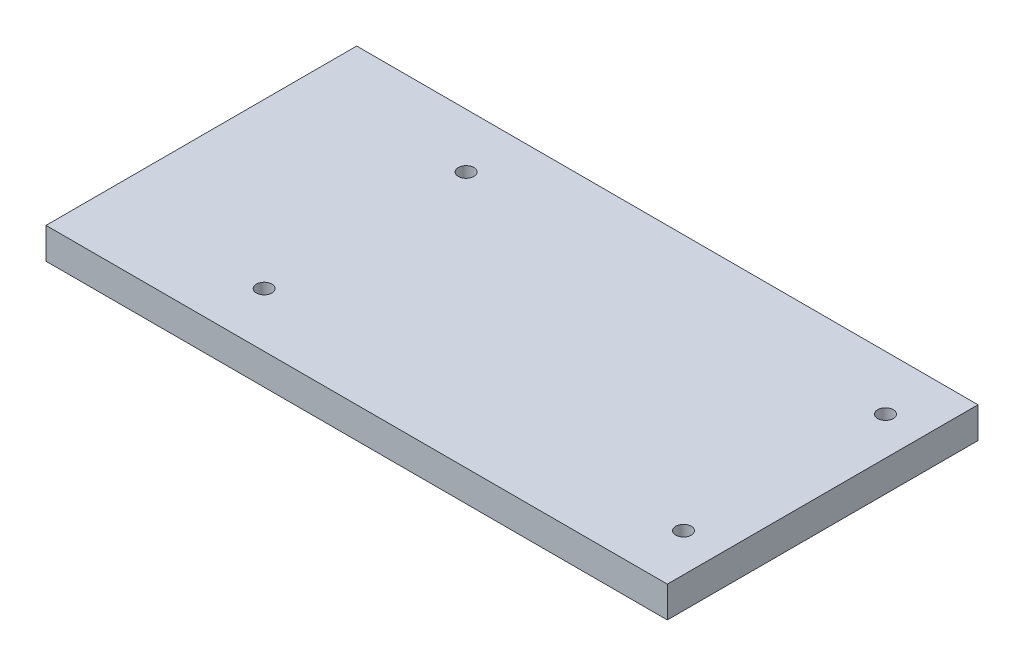
ISO-10303-21;
HEADER;
FILE_DESCRIPTION(('STEP AP214'),'2;1');
FILE_NAME('part.step','',(''),(''),'','','');
FILE_SCHEMA(('AUTOMOTIVE_DESIGN { 1 0 10303 214 1 1 1 1 }'));
ENDSEC;
DATA;
#1=APPLICATION_CONTEXT('core data for automotive mechanical design processes');
#2=APPLICATION_PROTOCOL_DEFINITION('international standard','automotive_design',2000,#1);
#3=PRODUCT_CONTEXT('',#1,'mechanical');
#4=PRODUCT('Part','Part','',(#3));
#5=PRODUCT_RELATED_PRODUCT_CATEGORY('part','',(#4));
#6=PRODUCT_DEFINITION_FORMATION('','',#4);
#7=PRODUCT_DEFINITION_CONTEXT('part definition',#1,'design');
#8=PRODUCT_DEFINITION('design','',#6,#7);
#9=PRODUCT_DEFINITION_SHAPE('','',#8);
#10=(LENGTH_UNIT() NAMED_UNIT(*) SI_UNIT(.MILLI.,.METRE.));
#11=(NAMED_UNIT(*) PLANE_ANGLE_UNIT() SI_UNIT($,.RADIAN.));
#12=(NAMED_UNIT(*) SI_UNIT($,.STERADIAN.) SOLID_ANGLE_UNIT());
#13=UNCERTAINTY_MEASURE_WITH_UNIT(LENGTH_MEASURE(1.E-05),#10,'distance_accuracy_value','');
#14=(GEOMETRIC_REPRESENTATION_CONTEXT(3) GLOBAL_UNCERTAINTY_ASSIGNED_CONTEXT((#13)) GLOBAL_UNIT_ASSIGNED_CONTEXT((#10,
#11,#12)) REPRESENTATION_CONTEXT('',''));
#15=CARTESIAN_POINT('',(0.,0.,0.));
#16=DIRECTION('',(0.,0.,1.));
#17=DIRECTION('',(1.,0.,0.));
#18=AXIS2_PLACEMENT_3D('',#15,#16,#17);
#19=CARTESIAN_POINT('',(-100.,10.,50.));
#20=DIRECTION('',(1.,0.,0.));
#21=DIRECTION('',(0.,0.,-1.));
#22=AXIS2_PLACEMENT_3D('',#19,#20,#21);
#23=PLANE('',#22);
#24=DIRECTION('',(0.,0.,1.));
#25=VECTOR('',#24,1.);
#26=CARTESIAN_POINT('',(-100.,0.,50.));
#27=LINE('',#26,#25);
#28=CARTESIAN_POINT('',(-100.,0.,-50.));
#29=VERTEX_POINT('',#28);
#30=CARTESIAN_POINT('',(-100.,0.,50.));
#31=VERTEX_POINT('',#30);
#32=EDGE_CURVE('E99',#29,#31,#27,.T.);
#33=ORIENTED_EDGE('',*,*,#32,.T.);
#34=DIRECTION('',(0.,-1.,0.));
#35=VECTOR('',#34,1.);
#36=CARTESIAN_POINT('',(-100.,10.,50.));
#37=LINE('',#36,#35);
#38=CARTESIAN_POINT('',(-100.,10.,50.));
#39=VERTEX_POINT('',#38);
#40=EDGE_CURVE('E11',#39,#31,#37,.T.);
#41=ORIENTED_EDGE('',*,*,#40,.F.);
#42=DIRECTION('',(0.,0.,1.));
#43=VECTOR('',#42,1.);
#44=CARTESIAN_POINT('',(-100.,10.,50.));
#45=LINE('',#44,#43);
#46=CARTESIAN_POINT('',(-100.,10.,-50.));
#47=VERTEX_POINT('',#46);
#48=EDGE_CURVE('E87',#47,#39,#45,.T.);
#49=ORIENTED_EDGE('',*,*,#48,.F.);
#50=DIRECTION('',(0.,-1.,0.));
#51=VECTOR('',#50,1.);
#52=CARTESIAN_POINT('',(-100.,10.,-50.));
#53=LINE('',#52,#51);
#54=EDGE_CURVE('E95',#47,#29,#53,.T.);
#55=ORIENTED_EDGE('',*,*,#54,.T.);
#56=EDGE_LOOP('',(#33,#41,#49,#55));
#57=FACE_BOUND('',#56,.T.);
#58=ADVANCED_FACE('F36',(#57),#23,.F.);
#59=CARTESIAN_POINT('',(100.,10.,50.));
#60=DIRECTION('',(0.,0.,-1.));
#61=DIRECTION('',(-1.,0.,0.));
#62=AXIS2_PLACEMENT_3D('',#59,#60,#61);
#63=PLANE('',#62);
#64=DIRECTION('',(1.,0.,0.));
#65=VECTOR('',#64,1.);
#66=CARTESIAN_POINT('',(100.,0.,50.));
#67=LINE('',#66,#65);
#68=CARTESIAN_POINT('',(100.,0.,50.));
#69=VERTEX_POINT('',#68);
#70=EDGE_CURVE('E91',#31,#69,#67,.T.);
#71=ORIENTED_EDGE('',*,*,#70,.T.);
#72=DIRECTION('',(0.,-1.,0.));
#73=VECTOR('',#72,1.);
#74=CARTESIAN_POINT('',(100.,10.,50.));
#75=LINE('',#74,#73);
#76=CARTESIAN_POINT('',(100.,10.,50.));
#77=VERTEX_POINT('',#76);
#78=EDGE_CURVE('E44',#77,#69,#75,.T.);
#79=ORIENTED_EDGE('',*,*,#78,.F.);
#80=DIRECTION('',(1.,0.,0.));
#81=VECTOR('',#80,1.);
#82=CARTESIAN_POINT('',(100.,10.,50.));
#83=LINE('',#82,#81);
#84=EDGE_CURVE('E82',#39,#77,#83,.T.);
#85=ORIENTED_EDGE('',*,*,#84,.F.);
#86=ORIENTED_EDGE('',*,*,#40,.T.);
#87=EDGE_LOOP('',(#71,#79,#85,#86));
#88=FACE_BOUND('',#87,.T.);
#89=ADVANCED_FACE('F90',(#88),#63,.F.);
#90=CARTESIAN_POINT('',(100.,10.,50.));
#91=DIRECTION('',(-1.,0.,0.));
#92=DIRECTION('',(0.,0.,1.));
#93=AXIS2_PLACEMENT_3D('',#90,#91,#92);
#94=PLANE('',#93);
#95=DIRECTION('',(0.,0.,-1.));
#96=VECTOR('',#95,1.);
#97=CARTESIAN_POINT('',(100.,0.,50.));
#98=LINE('',#97,#96);
#99=CARTESIAN_POINT('',(100.,0.,-50.));
#100=VERTEX_POINT('',#99);
#101=EDGE_CURVE('E69',#69,#100,#98,.T.);
#102=ORIENTED_EDGE('',*,*,#101,.T.);
#103=DIRECTION('',(0.,-1.,0.));
#104=VECTOR('',#103,1.);
#105=CARTESIAN_POINT('',(100.,10.,-50.));
#106=LINE('',#105,#104);
#107=CARTESIAN_POINT('',(100.,10.,-50.));
#108=VERTEX_POINT('',#107);
#109=EDGE_CURVE('E92',#108,#100,#106,.T.);
#110=ORIENTED_EDGE('',*,*,#109,.F.);
#111=DIRECTION('',(0.,0.,-1.));
#112=VECTOR('',#111,1.);
#113=CARTESIAN_POINT('',(100.,10.,50.));
#114=LINE('',#113,#112);
#115=EDGE_CURVE('E85',#77,#108,#114,.T.);
#116=ORIENTED_EDGE('',*,*,#115,.F.);
#117=ORIENTED_EDGE('',*,*,#78,.T.);
#118=EDGE_LOOP('',(#102,#110,#116,#117));
#119=FACE_BOUND('',#118,.T.);
#120=ADVANCED_FACE('F93',(#119),#94,.F.);
#121=CARTESIAN_POINT('',(100.,10.,-50.));
#122=DIRECTION('',(0.,0.,1.));
#123=DIRECTION('',(1.,0.,0.));
#124=AXIS2_PLACEMENT_3D('',#121,#122,#123);
#125=PLANE('',#124);
#126=DIRECTION('',(-1.,0.,0.));
#127=VECTOR('',#126,1.);
#128=CARTESIAN_POINT('',(100.,0.,-50.));
#129=LINE('',#128,#127);
#130=EDGE_CURVE('E75',#100,#29,#129,.T.);
#131=ORIENTED_EDGE('',*,*,#130,.T.);
#132=ORIENTED_EDGE('',*,*,#54,.F.);
#133=DIRECTION('',(-1.,0.,0.));
#134=VECTOR('',#133,1.);
#135=CARTESIAN_POINT('',(100.,10.,-50.));
#136=LINE('',#135,#134);
#137=EDGE_CURVE('E52',#108,#47,#136,.T.);
#138=ORIENTED_EDGE('',*,*,#137,.F.);
#139=ORIENTED_EDGE('',*,*,#109,.T.);
#140=EDGE_LOOP('',(#131,#132,#138,#139));
#141=FACE_BOUND('',#140,.T.);
#142=ADVANCED_FACE('F107',(#141),#125,.F.);
#143=CARTESIAN_POINT('',(0.,10.,0.));
#144=DIRECTION('',(0.,1.,0.));
#145=DIRECTION('',(0.,0.,1.));
#146=AXIS2_PLACEMENT_3D('',#143,#144,#145);
#147=PLANE('',#146);
#148=CARTESIAN_POINT('',(87.72,10.,-32.5));
#149=DIRECTION('',(0.,1.,0.));
#150=DIRECTION('',(0.,0.,1.));
#151=AXIS2_PLACEMENT_3D('',#148,#149,#150);
#152=CIRCLE('',#151,2.50000000000001);
#153=CARTESIAN_POINT('',(87.72,10.,-30.));
#154=VERTEX_POINT('',#153);
#155=EDGE_CURVE('E122',#154,#154,#152,.T.);
#156=ORIENTED_EDGE('',*,*,#155,.F.);
#157=EDGE_LOOP('',(#156));
#158=FACE_BOUND('',#157,.T.);
#159=CARTESIAN_POINT('',(-47.28,10.,32.5));
#160=DIRECTION('',(0.,1.,0.));
#161=DIRECTION('',(0.,0.,1.));
#162=AXIS2_PLACEMENT_3D('',#159,#160,#161);
#163=CIRCLE('',#162,2.5);
#164=CARTESIAN_POINT('',(-47.28,10.,35.));
#165=VERTEX_POINT('',#164);
#166=EDGE_CURVE('E123',#165,#165,#163,.T.);
#167=ORIENTED_EDGE('',*,*,#166,.F.);
#168=EDGE_LOOP('',(#167));
#169=FACE_BOUND('',#168,.T.);
#170=CARTESIAN_POINT('',(87.72,10.,32.5));
#171=DIRECTION('',(0.,1.,0.));
#172=DIRECTION('',(0.,0.,1.));
#173=AXIS2_PLACEMENT_3D('',#170,#171,#172);
#174=CIRCLE('',#173,2.5);
#175=CARTESIAN_POINT('',(87.72,10.,35.));
#176=VERTEX_POINT('',#175);
#177=EDGE_CURVE('E133',#176,#176,#174,.T.);
#178=ORIENTED_EDGE('',*,*,#177,.F.);
#179=EDGE_LOOP('',(#178));
#180=FACE_BOUND('',#179,.T.);
#181=CARTESIAN_POINT('',(-47.28,10.,-32.5));
#182=DIRECTION('',(0.,1.,0.));
#183=DIRECTION('',(0.,0.,1.));
#184=AXIS2_PLACEMENT_3D('',#181,#182,#183);
#185=CIRCLE('',#184,2.5);
#186=CARTESIAN_POINT('',(-47.28,10.,-30.));
#187=VERTEX_POINT('',#186);
#188=EDGE_CURVE('E115',#187,#187,#185,.T.);
#189=ORIENTED_EDGE('',*,*,#188,.F.);
#190=EDGE_LOOP('',(#189));
#191=FACE_BOUND('',#190,.T.);
#192=ORIENTED_EDGE('',*,*,#48,.T.);
#193=ORIENTED_EDGE('',*,*,#84,.T.);
#194=ORIENTED_EDGE('',*,*,#115,.T.);
#195=ORIENTED_EDGE('',*,*,#137,.T.);
#196=EDGE_LOOP('',(#192,#193,#194,#195));
#197=FACE_BOUND('',#196,.T.);
#198=ADVANCED_FACE('F83',(#158,#169,#180,#191,#197),#147,.T.);
#199=CARTESIAN_POINT('',(0.,0.,0.));
#200=DIRECTION('',(0.,1.,0.));
#201=DIRECTION('',(0.,0.,1.));
#202=AXIS2_PLACEMENT_3D('',#199,#200,#201);
#203=PLANE('',#202);
#204=CARTESIAN_POINT('',(87.72,0.,-32.5));
#205=DIRECTION('',(0.,1.,0.));
#206=DIRECTION('',(0.,0.,1.));
#207=AXIS2_PLACEMENT_3D('',#204,#205,#206);
#208=CIRCLE('',#207,2.50000000000001);
#209=CARTESIAN_POINT('',(87.72,0.,-30.));
#210=VERTEX_POINT('',#209);
#211=EDGE_CURVE('E118',#210,#210,#208,.F.);
#212=ORIENTED_EDGE('',*,*,#211,.F.);
#213=EDGE_LOOP('',(#212));
#214=FACE_BOUND('',#213,.T.);
#215=CARTESIAN_POINT('',(-47.28,0.,32.5));
#216=DIRECTION('',(0.,1.,0.));
#217=DIRECTION('',(0.,0.,1.));
#218=AXIS2_PLACEMENT_3D('',#215,#216,#217);
#219=CIRCLE('',#218,2.5);
#220=CARTESIAN_POINT('',(-47.28,0.,35.));
#221=VERTEX_POINT('',#220);
#222=EDGE_CURVE('E119',#221,#221,#219,.F.);
#223=ORIENTED_EDGE('',*,*,#222,.F.);
#224=EDGE_LOOP('',(#223));
#225=FACE_BOUND('',#224,.T.);
#226=CARTESIAN_POINT('',(87.72,0.,32.5));
#227=DIRECTION('',(0.,1.,0.));
#228=DIRECTION('',(0.,0.,1.));
#229=AXIS2_PLACEMENT_3D('',#226,#227,#228);
#230=CIRCLE('',#229,2.5);
#231=CARTESIAN_POINT('',(87.72,0.,35.));
#232=VERTEX_POINT('',#231);
#233=EDGE_CURVE('E126',#232,#232,#230,.F.);
#234=ORIENTED_EDGE('',*,*,#233,.F.);
#235=EDGE_LOOP('',(#234));
#236=FACE_BOUND('',#235,.T.);
#237=CARTESIAN_POINT('',(-47.28,0.,-32.5));
#238=DIRECTION('',(0.,1.,0.));
#239=DIRECTION('',(0.,0.,1.));
#240=AXIS2_PLACEMENT_3D('',#237,#238,#239);
#241=CIRCLE('',#240,2.5);
#242=CARTESIAN_POINT('',(-47.28,0.,-30.));
#243=VERTEX_POINT('',#242);
#244=EDGE_CURVE('E102',#243,#243,#241,.F.);
#245=ORIENTED_EDGE('',*,*,#244,.F.);
#246=EDGE_LOOP('',(#245));
#247=FACE_BOUND('',#246,.T.);
#248=ORIENTED_EDGE('',*,*,#32,.F.);
#249=ORIENTED_EDGE('',*,*,#130,.F.);
#250=ORIENTED_EDGE('',*,*,#101,.F.);
#251=ORIENTED_EDGE('',*,*,#70,.F.);
#252=EDGE_LOOP('',(#248,#249,#250,#251));
#253=FACE_BOUND('',#252,.T.);
#254=ADVANCED_FACE('F110',(#214,#225,#236,#247,#253),#203,.F.);
#255=CARTESIAN_POINT('',(-47.28,-0.000999999999999265,-32.5));
#256=DIRECTION('',(0.,1.,0.));
#257=DIRECTION('',(0.,0.,1.));
#258=AXIS2_PLACEMENT_3D('',#255,#256,#257);
#259=CYLINDRICAL_SURFACE('',#258,2.5);
#260=ORIENTED_EDGE('',*,*,#188,.T.);
#261=EDGE_LOOP('',(#260));
#262=FACE_BOUND('',#261,.T.);
#263=ORIENTED_EDGE('',*,*,#244,.T.);
#264=EDGE_LOOP('',(#263));
#265=FACE_BOUND('',#264,.T.);
#266=ADVANCED_FACE('F146',(#262,#265),#259,.F.);
#267=CARTESIAN_POINT('',(87.72,-0.000999999999999265,32.5));
#268=DIRECTION('',(0.,1.,0.));
#269=DIRECTION('',(0.,0.,1.));
#270=AXIS2_PLACEMENT_3D('',#267,#268,#269);
#271=CYLINDRICAL_SURFACE('',#270,2.5);
#272=ORIENTED_EDGE('',*,*,#177,.T.);
#273=EDGE_LOOP('',(#272));
#274=FACE_BOUND('',#273,.T.);
#275=ORIENTED_EDGE('',*,*,#233,.T.);
#276=EDGE_LOOP('',(#275));
#277=FACE_BOUND('',#276,.T.);
#278=ADVANCED_FACE('F137',(#274,#277),#271,.F.);
#279=CARTESIAN_POINT('',(-47.28,-0.000999999999999265,32.5));
#280=DIRECTION('',(0.,1.,0.));
#281=DIRECTION('',(0.,0.,1.));
#282=AXIS2_PLACEMENT_3D('',#279,#280,#281);
#283=CYLINDRICAL_SURFACE('',#282,2.5);
#284=ORIENTED_EDGE('',*,*,#166,.T.);
#285=EDGE_LOOP('',(#284));
#286=FACE_BOUND('',#285,.T.);
#287=ORIENTED_EDGE('',*,*,#222,.T.);
#288=EDGE_LOOP('',(#287));
#289=FACE_BOUND('',#288,.T.);
#290=ADVANCED_FACE('F196',(#286,#289),#283,.F.);
#291=CARTESIAN_POINT('',(87.72,-0.000999999999999265,-32.5));
#292=DIRECTION('',(0.,1.,0.));
#293=DIRECTION('',(0.,0.,1.));
#294=AXIS2_PLACEMENT_3D('',#291,#292,#293);
#295=CYLINDRICAL_SURFACE('',#294,2.50000000000001);
#296=ORIENTED_EDGE('',*,*,#155,.T.);
#297=EDGE_LOOP('',(#296));
#298=FACE_BOUND('',#297,.T.);
#299=ORIENTED_EDGE('',*,*,#211,.T.);
#300=EDGE_LOOP('',(#299));
#301=FACE_BOUND('',#300,.T.);
#302=ADVANCED_FACE('F205',(#298,#301),#295,.F.);
#303=CLOSED_SHELL('',(#58,#89,#120,#142,#198,#254,#266,#278,#290,#302));
#304=MANIFOLD_SOLID_BREP('B2',#303);
#305=ADVANCED_BREP_SHAPE_REPRESENTATION('',(#18,#304),#14);
#306=SHAPE_DEFINITION_REPRESENTATION(#9,#305);
ENDSEC;
END-ISO-10303-21;
